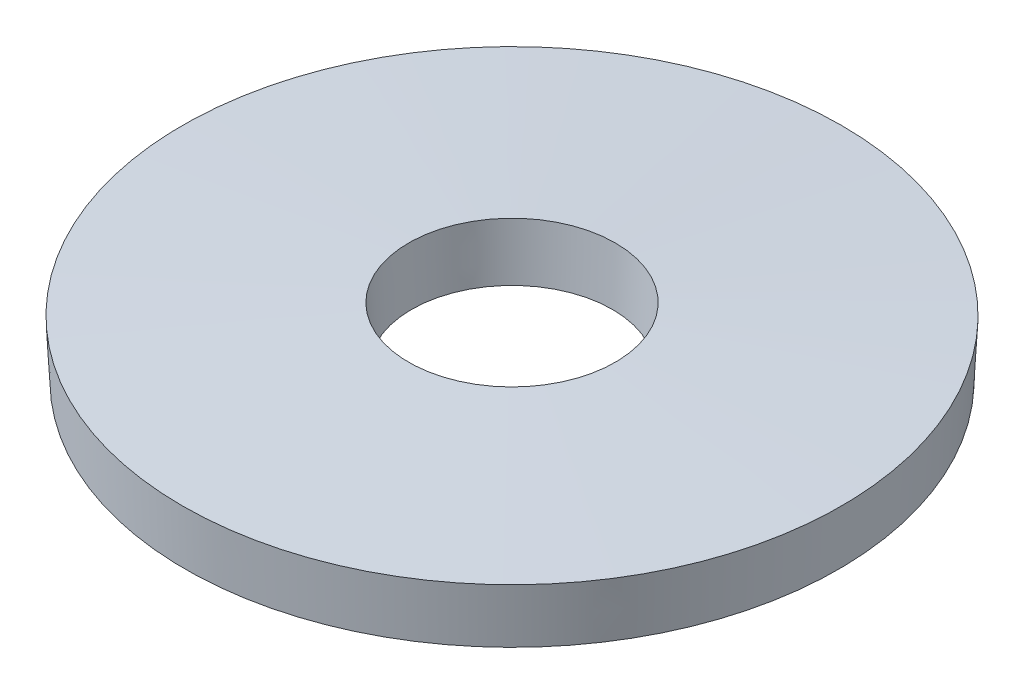
ISO-10303-21;
HEADER;
FILE_DESCRIPTION(('STEP AP214'),'2;1');
FILE_NAME('part.step','',(''),(''),'','','');
FILE_SCHEMA(('AUTOMOTIVE_DESIGN { 1 0 10303 214 1 1 1 1 }'));
ENDSEC;
DATA;
#1=APPLICATION_CONTEXT('core data for automotive mechanical design processes');
#2=APPLICATION_PROTOCOL_DEFINITION('international standard','automotive_design',2000,#1);
#3=PRODUCT_CONTEXT('',#1,'mechanical');
#4=PRODUCT('Part','Part','',(#3));
#5=PRODUCT_RELATED_PRODUCT_CATEGORY('part','',(#4));
#6=PRODUCT_DEFINITION_FORMATION('','',#4);
#7=PRODUCT_DEFINITION_CONTEXT('part definition',#1,'design');
#8=PRODUCT_DEFINITION('design','',#6,#7);
#9=PRODUCT_DEFINITION_SHAPE('','',#8);
#10=(LENGTH_UNIT() NAMED_UNIT(*) SI_UNIT(.MILLI.,.METRE.));
#11=(NAMED_UNIT(*) PLANE_ANGLE_UNIT() SI_UNIT($,.RADIAN.));
#12=(NAMED_UNIT(*) SI_UNIT($,.STERADIAN.) SOLID_ANGLE_UNIT());
#13=UNCERTAINTY_MEASURE_WITH_UNIT(LENGTH_MEASURE(1.E-05),#10,'distance_accuracy_value','');
#14=(GEOMETRIC_REPRESENTATION_CONTEXT(3) GLOBAL_UNCERTAINTY_ASSIGNED_CONTEXT((#13)) GLOBAL_UNIT_ASSIGNED_CONTEXT((#10,
#11,#12)) REPRESENTATION_CONTEXT('',''));
#15=CARTESIAN_POINT('',(0.,0.,0.));
#16=DIRECTION('',(0.,0.,1.));
#17=DIRECTION('',(1.,0.,0.));
#18=AXIS2_PLACEMENT_3D('',#15,#16,#17);
#19=CARTESIAN_POINT('',(0.,3.55154746420261,0.));
#20=DIRECTION('',(0.,1.,0.));
#21=DIRECTION('',(0.,0.,1.));
#22=AXIS2_PLACEMENT_3D('',#19,#20,#21);
#23=CONICAL_SURFACE('',#22,20.8153949395459,0.0500475886693486);
#24=CARTESIAN_POINT('',(0.,0.,0.));
#25=DIRECTION('',(0.,-1.,0.));
#26=DIRECTION('',(0.,0.,-1.));
#27=AXIS2_PLACEMENT_3D('',#24,#25,#26);
#28=CIRCLE('',#27,20.6375);
#29=CARTESIAN_POINT('',(0.,0.,-20.6375));
#30=VERTEX_POINT('',#29);
#31=EDGE_CURVE('E10',#30,#30,#28,.T.);
#32=ORIENTED_EDGE('',*,*,#31,.F.);
#33=EDGE_LOOP('',(#32));
#34=FACE_BOUND('',#33,.T.);
#35=CARTESIAN_POINT('',(0.,3.55154746420261,0.));
#36=DIRECTION('',(0.,-1.,0.));
#37=DIRECTION('',(0.,0.,-1.));
#38=AXIS2_PLACEMENT_3D('',#35,#36,#37);
#39=CIRCLE('',#38,20.8153949395459);
#40=CARTESIAN_POINT('',(0.,3.55154746420261,-20.8153949395458));
#41=VERTEX_POINT('',#40);
#42=EDGE_CURVE('E48',#41,#41,#39,.T.);
#43=ORIENTED_EDGE('',*,*,#42,.T.);
#44=EDGE_LOOP('',(#43));
#45=FACE_BOUND('',#44,.T.);
#46=ADVANCED_FACE('F34',(#34,#45),#23,.T.);
#47=CARTESIAN_POINT('',(0.,0.,0.));
#48=DIRECTION('',(0.,-1.,0.));
#49=DIRECTION('',(0.,0.,-1.));
#50=AXIS2_PLACEMENT_3D('',#47,#48,#49);
#51=CONICAL_SURFACE('',#50,20.6375,1.52074873812555);
#52=CARTESIAN_POINT('',(0.,0.715652535797392,0.));
#53=DIRECTION('',(0.,-1.,0.));
#54=DIRECTION('',(0.,0.,-1.));
#55=AXIS2_PLACEMENT_3D('',#52,#53,#54);
#56=CIRCLE('',#55,6.35);
#57=CARTESIAN_POINT('',(0.,0.715652535797392,-6.35));
#58=VERTEX_POINT('',#57);
#59=EDGE_CURVE('E40',#58,#58,#56,.T.);
#60=CARTESIAN_POINT('',(0.,0.715652535797392,-6.35));
#61=CARTESIAN_POINT('',(0.,0.708197821882836,-6.498828125));
#62=CARTESIAN_POINT('',(0.,0.70074310796828,-6.64765625));
#63=CARTESIAN_POINT('',(0.,0.685833680139167,-6.9453125));
#64=CARTESIAN_POINT('',(0.,0.678378966224611,-7.094140625));
#65=CARTESIAN_POINT('',(0.,0.663469538395499,-7.391796875));
#66=CARTESIAN_POINT('',(0.,0.656014824480943,-7.540625));
#67=CARTESIAN_POINT('',(0.,0.64110539665183,-7.83828125));
#68=CARTESIAN_POINT('',(0.,0.633650682737274,-7.987109375));
#69=CARTESIAN_POINT('',(0.,0.618741254908162,-8.284765625));
#70=CARTESIAN_POINT('',(0.,0.611286540993606,-8.43359375));
#71=CARTESIAN_POINT('',(0.,0.596377113164493,-8.73125));
#72=CARTESIAN_POINT('',(0.,0.588922399249937,-8.880078125));
#73=CARTESIAN_POINT('',(0.,0.574012971420825,-9.177734375));
#74=CARTESIAN_POINT('',(0.,0.566558257506269,-9.3265625));
#75=CARTESIAN_POINT('',(0.,0.551648829677156,-9.62421875));
#76=CARTESIAN_POINT('',(0.,0.5441941157626,-9.773046875));
#77=CARTESIAN_POINT('',(0.,0.529284687933488,-10.070703125));
#78=CARTESIAN_POINT('',(0.,0.521829974018932,-10.21953125));
#79=CARTESIAN_POINT('',(0.,0.506920546189819,-10.5171875));
#80=CARTESIAN_POINT('',(0.,0.499465832275263,-10.666015625));
#81=CARTESIAN_POINT('',(0.,0.484556404446151,-10.963671875));
#82=CARTESIAN_POINT('',(0.,0.477101690531595,-11.1125));
#83=CARTESIAN_POINT('',(0.,0.462192262702482,-11.41015625));
#84=CARTESIAN_POINT('',(0.,0.454737548787926,-11.558984375));
#85=CARTESIAN_POINT('',(0.,0.439828120958814,-11.856640625));
#86=CARTESIAN_POINT('',(0.,0.432373407044258,-12.00546875));
#87=CARTESIAN_POINT('',(0.,0.417463979215145,-12.303125));
#88=CARTESIAN_POINT('',(0.,0.410009265300589,-12.451953125));
#89=CARTESIAN_POINT('',(0.,0.395099837471477,-12.749609375));
#90=CARTESIAN_POINT('',(0.,0.387645123556921,-12.8984375));
#91=CARTESIAN_POINT('',(0.,0.372735695727808,-13.19609375));
#92=CARTESIAN_POINT('',(0.,0.365280981813252,-13.344921875));
#93=CARTESIAN_POINT('',(0.,0.35037155398414,-13.642578125));
#94=CARTESIAN_POINT('',(0.,0.342916840069584,-13.79140625));
#95=CARTESIAN_POINT('',(0.,0.328007412240471,-14.0890625));
#96=CARTESIAN_POINT('',(0.,0.320552698325915,-14.237890625));
#97=CARTESIAN_POINT('',(0.,0.305643270496803,-14.535546875));
#98=CARTESIAN_POINT('',(0.,0.298188556582247,-14.684375));
#99=CARTESIAN_POINT('',(0.,0.283279128753134,-14.98203125));
#100=CARTESIAN_POINT('',(0.,0.275824414838578,-15.130859375));
#101=CARTESIAN_POINT('',(0.,0.260914987009466,-15.428515625));
#102=CARTESIAN_POINT('',(0.,0.25346027309491,-15.57734375));
#103=CARTESIAN_POINT('',(0.,0.238550845265797,-15.875));
#104=CARTESIAN_POINT('',(0.,0.231096131351241,-16.023828125));
#105=CARTESIAN_POINT('',(0.,0.216186703522129,-16.321484375));
#106=CARTESIAN_POINT('',(0.,0.208731989607573,-16.4703125));
#107=CARTESIAN_POINT('',(0.,0.19382256177846,-16.76796875));
#108=CARTESIAN_POINT('',(0.,0.186367847863904,-16.916796875));
#109=CARTESIAN_POINT('',(0.,0.171458420034792,-17.214453125));
#110=CARTESIAN_POINT('',(0.,0.164003706120236,-17.36328125));
#111=CARTESIAN_POINT('',(0.,0.149094278291123,-17.6609375));
#112=CARTESIAN_POINT('',(0.,0.141639564376567,-17.809765625));
#113=CARTESIAN_POINT('',(0.,0.126730136547455,-18.107421875));
#114=CARTESIAN_POINT('',(0.,0.119275422632899,-18.25625));
#115=CARTESIAN_POINT('',(0.,0.104365994803786,-18.55390625));
#116=CARTESIAN_POINT('',(0.,0.0969112808892302,-18.702734375));
#117=CARTESIAN_POINT('',(0.,0.0820018530601178,-19.000390625));
#118=CARTESIAN_POINT('',(0.,0.0745471391455617,-19.14921875));
#119=CARTESIAN_POINT('',(0.,0.0596377113164493,-19.446875));
#120=CARTESIAN_POINT('',(0.,0.0521829974018931,-19.595703125));
#121=CARTESIAN_POINT('',(0.,0.0372735695727808,-19.893359375));
#122=CARTESIAN_POINT('',(0.,0.0298188556582247,-20.0421875));
#123=CARTESIAN_POINT('',(0.,0.0149094278291124,-20.33984375));
#124=CARTESIAN_POINT('',(0.,0.00745471391455622,-20.488671875));
#125=CARTESIAN_POINT('',(0.,0.,-20.6375));
#126=B_SPLINE_CURVE_WITH_KNOTS('',3,(#60,#61,#62,#63,#64,#65,#66,#67,#68,#69,#70,#71,#72,#73,
#74,#75,#76,#77,#78,#79,#80,#81,#82,#83,#84,#85,#86,#87,#88,#89,#90,#91,#92,#93,#94,#95,#96,#97,
#98,#99,#100,#101,#102,#103,#104,#105,#106,#107,#108,#109,#110,#111,#112,#113,#114,#115,#116,
#117,#118,#119,#120,#121,#122,#123,#124,#125),.UNSPECIFIED.,.F.,.F.,(4,2,2,2,2,2,2,2,2,2,2,2,2,
2,2,2,2,2,2,2,2,2,2,2,2,2,2,2,2,2,2,2,4),(0.,0.447044127525542,0.894088255051081,
1.34113238257662,1.78817651010216,2.2352206376277,2.68226476515324,3.12930889267878,
3.57635302020432,4.02339714772987,4.4704412752554,4.91748540278094,5.36452953030648,
5.81157365783202,6.25861778535756,6.7056619128831,7.15270604040864,7.59975016793418,
8.04679429545972,8.49383842298526,8.94088255051081,9.38792667803635,9.83497080556189,
10.2820149330874,10.729059060613,11.1761031881385,11.623147315664,12.0701914431896,
12.5172355707151,12.9642796982407,13.4113238257662,13.8583679532918,14.3054120808173),.UNSPECIFIED.);
#127=EDGE_CURVE('BSEAM63',#58,#30,#126,.T.);
#128=ORIENTED_EDGE('',*,*,#59,.F.);
#129=ORIENTED_EDGE('',*,*,#31,.T.);
#130=ORIENTED_EDGE('',*,*,#127,.T.);
#131=ORIENTED_EDGE('',*,*,#127,.F.);
#132=EDGE_LOOP('',(#128,#130,#129,#131));
#133=FACE_BOUND('',#132,.T.);
#134=ADVANCED_FACE('F63',(#133),#51,.F.);
#135=CARTESIAN_POINT('',(0.,0.715652535797392,0.));
#136=DIRECTION('',(0.,1.,0.));
#137=DIRECTION('',(0.,0.,1.));
#138=AXIS2_PLACEMENT_3D('',#135,#136,#137);
#139=CONICAL_SURFACE('',#138,6.35,0.0500475886693481);
#140=CARTESIAN_POINT('',(0.,4.2672,0.));
#141=DIRECTION('',(0.,-1.,0.));
#142=DIRECTION('',(0.,0.,-1.));
#143=AXIS2_PLACEMENT_3D('',#140,#141,#142);
#144=CIRCLE('',#143,6.52789493954585);
#145=CARTESIAN_POINT('',(0.,4.2672,-6.52789493954585));
#146=VERTEX_POINT('',#145);
#147=EDGE_CURVE('E44',#146,#146,#144,.T.);
#148=ORIENTED_EDGE('',*,*,#147,.F.);
#149=EDGE_LOOP('',(#148));
#150=FACE_BOUND('',#149,.T.);
#151=ORIENTED_EDGE('',*,*,#59,.T.);
#152=EDGE_LOOP('',(#151));
#153=FACE_BOUND('',#152,.T.);
#154=ADVANCED_FACE('F58',(#150,#153),#139,.F.);
#155=CARTESIAN_POINT('',(0.,4.2672,0.));
#156=DIRECTION('',(0.,-1.,0.));
#157=DIRECTION('',(0.,0.,-1.));
#158=AXIS2_PLACEMENT_3D('',#155,#156,#157);
#159=CONICAL_SURFACE('',#158,6.52789493954585,1.52074873812555);
#160=CARTESIAN_POINT('',(0.,3.55154746420261,-20.8153949395458));
#161=CARTESIAN_POINT('',(0.,3.55900217811716,-20.6665668145458));
#162=CARTESIAN_POINT('',(0.,3.56645689203172,-20.5177386895458));
#163=CARTESIAN_POINT('',(0.,3.58136631986083,-20.2200824395458));
#164=CARTESIAN_POINT('',(0.,3.58882103377539,-20.0712543145458));
#165=CARTESIAN_POINT('',(0.,3.6037304616045,-19.7735980645458));
#166=CARTESIAN_POINT('',(0.,3.61118517551906,-19.6247699395458));
#167=CARTESIAN_POINT('',(0.,3.62609460334817,-19.3271136895458));
#168=CARTESIAN_POINT('',(0.,3.63354931726272,-19.1782855645458));
#169=CARTESIAN_POINT('',(0.,3.64845874509184,-18.8806293145458));
#170=CARTESIAN_POINT('',(0.,3.65591345900639,-18.7318011895458));
#171=CARTESIAN_POINT('',(0.,3.67082288683551,-18.4341449395458));
#172=CARTESIAN_POINT('',(0.,3.67827760075006,-18.2853168145458));
#173=CARTESIAN_POINT('',(0.,3.69318702857918,-17.9876605645458));
#174=CARTESIAN_POINT('',(0.,3.70064174249373,-17.8388324395458));
#175=CARTESIAN_POINT('',(0.,3.71555117032284,-17.5411761895458));
#176=CARTESIAN_POINT('',(0.,3.7230058842374,-17.3923480645458));
#177=CARTESIAN_POINT('',(0.,3.73791531206651,-17.0946918145458));
#178=CARTESIAN_POINT('',(0.,3.74537002598107,-16.9458636895458));
#179=CARTESIAN_POINT('',(0.,3.76027945381018,-16.6482074395458));
#180=CARTESIAN_POINT('',(0.,3.76773416772474,-16.4993793145458));
#181=CARTESIAN_POINT('',(0.,3.78264359555385,-16.2017230645458));
#182=CARTESIAN_POINT('',(0.,3.79009830946841,-16.0528949395458));
#183=CARTESIAN_POINT('',(0.,3.80500773729752,-15.7552386895458));
#184=CARTESIAN_POINT('',(0.,3.81246245121207,-15.6064105645458));
#185=CARTESIAN_POINT('',(0.,3.82737187904119,-15.3087543145458));
#186=CARTESIAN_POINT('',(0.,3.83482659295574,-15.1599261895458));
#187=CARTESIAN_POINT('',(0.,3.84973602078485,-14.8622699395458));
#188=CARTESIAN_POINT('',(0.,3.85719073469941,-14.7134418145458));
#189=CARTESIAN_POINT('',(0.,3.87210016252852,-14.4157855645458));
#190=CARTESIAN_POINT('',(0.,3.87955487644308,-14.2669574395458));
#191=CARTESIAN_POINT('',(0.,3.89446430427219,-13.9693011895458));
#192=CARTESIAN_POINT('',(0.,3.90191901818675,-13.8204730645458));
#193=CARTESIAN_POINT('',(0.,3.91682844601586,-13.5228168145458));
#194=CARTESIAN_POINT('',(0.,3.92428315993042,-13.3739886895458));
#195=CARTESIAN_POINT('',(0.,3.93919258775953,-13.0763324395458));
#196=CARTESIAN_POINT('',(0.,3.94664730167409,-12.9275043145458));
#197=CARTESIAN_POINT('',(0.,3.9615567295032,-12.6298480645458));
#198=CARTESIAN_POINT('',(0.,3.96901144341775,-12.4810199395458));
#199=CARTESIAN_POINT('',(0.,3.98392087124687,-12.1833636895458));
#200=CARTESIAN_POINT('',(0.,3.99137558516142,-12.0345355645458));
#201=CARTESIAN_POINT('',(0.,4.00628501299053,-11.7368793145458));
#202=CARTESIAN_POINT('',(0.,4.01373972690509,-11.5880511895458));
#203=CARTESIAN_POINT('',(0.,4.0286491547342,-11.2903949395458));
#204=CARTESIAN_POINT('',(0.,4.03610386864876,-11.1415668145458));
#205=CARTESIAN_POINT('',(0.,4.05101329647787,-10.8439105645458));
#206=CARTESIAN_POINT('',(0.,4.05846801039243,-10.6950824395458));
#207=CARTESIAN_POINT('',(0.,4.07337743822154,-10.3974261895458));
#208=CARTESIAN_POINT('',(0.,4.0808321521361,-10.2485980645458));
#209=CARTESIAN_POINT('',(0.,4.09574157996521,-9.95094181454585));
#210=CARTESIAN_POINT('',(0.,4.10319629387977,-9.80211368954584));
#211=CARTESIAN_POINT('',(0.,4.11810572170888,-9.50445743954584));
#212=CARTESIAN_POINT('',(0.,4.12556043562343,-9.35562931454585));
#213=CARTESIAN_POINT('',(0.,4.14046986345255,-9.05797306454584));
#214=CARTESIAN_POINT('',(0.,4.1479245773671,-8.90914493954585));
#215=CARTESIAN_POINT('',(0.,4.16283400519622,-8.61148868954584));
#216=CARTESIAN_POINT('',(0.,4.17028871911077,-8.46266056454584));
#217=CARTESIAN_POINT('',(0.,4.18519814693988,-8.16500431454585));
#218=CARTESIAN_POINT('',(0.,4.19265286085444,-8.01617618954584));
#219=CARTESIAN_POINT('',(0.,4.20756228868355,-7.71851993954584));
#220=CARTESIAN_POINT('',(0.,4.21501700259811,-7.56969181454584));
#221=CARTESIAN_POINT('',(0.,4.22992643042722,-7.27203556454584));
#222=CARTESIAN_POINT('',(0.,4.23738114434178,-7.12320743954584));
#223=CARTESIAN_POINT('',(0.,4.25229057217089,-6.82555118954584));
#224=CARTESIAN_POINT('',(0.,4.25974528608545,-6.67672306454584));
#225=CARTESIAN_POINT('',(0.,4.2672,-6.52789493954585));
#226=B_SPLINE_CURVE_WITH_KNOTS('',3,(#160,#161,#162,#163,#164,#165,#166,#167,#168,#169,#170,
#171,#172,#173,#174,#175,#176,#177,#178,#179,#180,#181,#182,#183,#184,#185,#186,#187,#188,#189,
#190,#191,#192,#193,#194,#195,#196,#197,#198,#199,#200,#201,#202,#203,#204,#205,#206,#207,#208,
#209,#210,#211,#212,#213,#214,#215,#216,#217,#218,#219,#220,#221,#222,#223,#224,#225),
.UNSPECIFIED.,.F.,.F.,(4,2,2,2,2,2,2,2,2,2,2,2,2,2,2,2,2,2,2,2,2,2,2,2,2,2,2,2,2,2,2,2,4),(0.,
0.447044127525541,0.894088255051081,1.34113238257662,1.78817651010216,2.2352206376277,
2.68226476515324,3.12930889267878,3.57635302020432,4.02339714772986,4.4704412752554,
4.91748540278094,5.36452953030648,5.81157365783202,6.25861778535756,6.7056619128831,
7.15270604040864,7.59975016793418,8.04679429545972,8.49383842298526,8.9408825505108,
9.38792667803634,9.83497080556188,10.2820149330874,10.729059060613,11.1761031881385,
11.623147315664,12.0701914431896,12.5172355707151,12.9642796982407,13.4113238257662,
13.8583679532917,14.3054120808173),.UNSPECIFIED.);
#227=EDGE_CURVE('BSEAM55',#41,#146,#226,.T.);
#228=ORIENTED_EDGE('',*,*,#42,.F.);
#229=ORIENTED_EDGE('',*,*,#147,.T.);
#230=ORIENTED_EDGE('',*,*,#227,.T.);
#231=ORIENTED_EDGE('',*,*,#227,.F.);
#232=EDGE_LOOP('',(#228,#230,#229,#231));
#233=FACE_BOUND('',#232,.T.);
#234=ADVANCED_FACE('F55',(#233),#159,.T.);
#235=CLOSED_SHELL('',(#46,#134,#154,#234));
#236=MANIFOLD_SOLID_BREP('B2',#235);
#237=ADVANCED_BREP_SHAPE_REPRESENTATION('',(#18,#236),#14);
#238=SHAPE_DEFINITION_REPRESENTATION(#9,#237);
ENDSEC;
END-ISO-10303-21;
